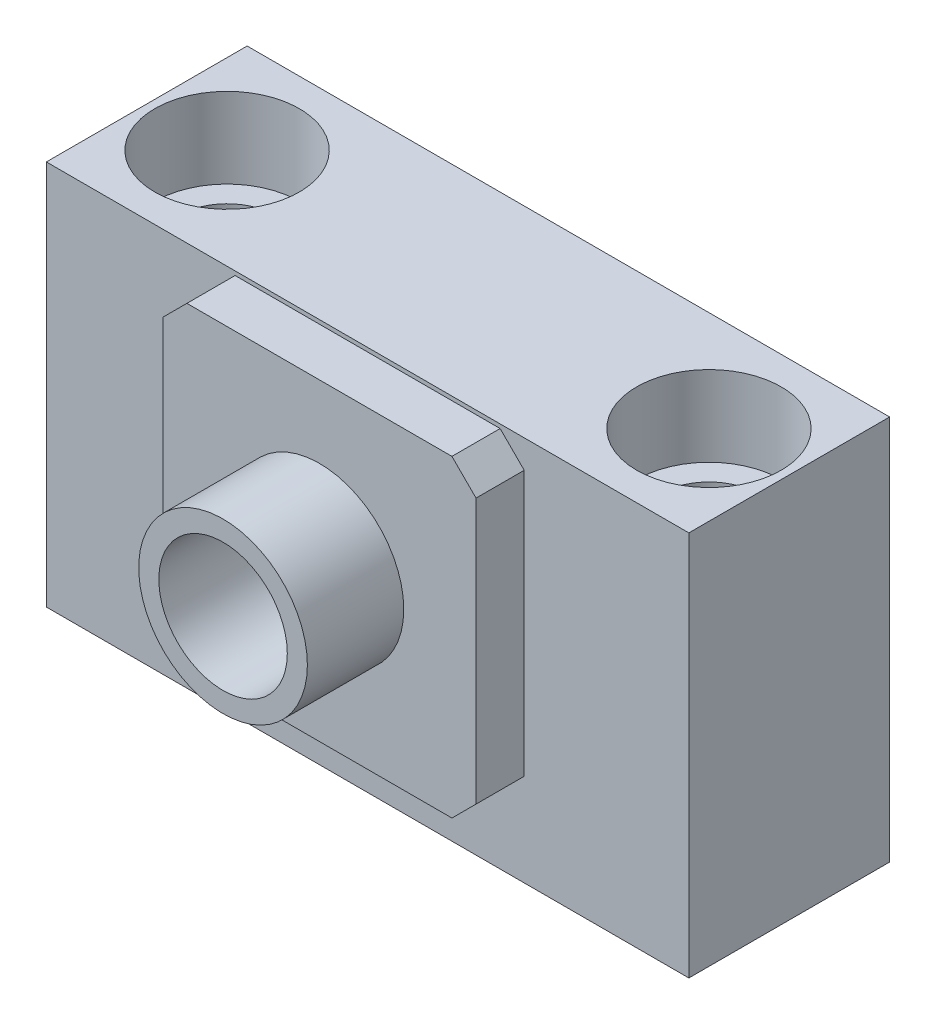
ISO-10303-21;
HEADER;
FILE_DESCRIPTION(('STEP AP214'),'2;1');
FILE_NAME('part.step','',(''),(''),'','','');
FILE_SCHEMA(('AUTOMOTIVE_DESIGN { 1 0 10303 214 1 1 1 1 }'));
ENDSEC;
DATA;
#1=APPLICATION_CONTEXT('core data for automotive mechanical design processes');
#2=APPLICATION_PROTOCOL_DEFINITION('international standard','automotive_design',2000,#1);
#3=PRODUCT_CONTEXT('',#1,'mechanical');
#4=PRODUCT('Part','Part','',(#3));
#5=PRODUCT_RELATED_PRODUCT_CATEGORY('part','',(#4));
#6=PRODUCT_DEFINITION_FORMATION('','',#4);
#7=PRODUCT_DEFINITION_CONTEXT('part definition',#1,'design');
#8=PRODUCT_DEFINITION('design','',#6,#7);
#9=PRODUCT_DEFINITION_SHAPE('','',#8);
#10=(LENGTH_UNIT() NAMED_UNIT(*) SI_UNIT(.MILLI.,.METRE.));
#11=(NAMED_UNIT(*) PLANE_ANGLE_UNIT() SI_UNIT($,.RADIAN.));
#12=(NAMED_UNIT(*) SI_UNIT($,.STERADIAN.) SOLID_ANGLE_UNIT());
#13=UNCERTAINTY_MEASURE_WITH_UNIT(LENGTH_MEASURE(1.E-05),#10,'distance_accuracy_value','');
#14=(GEOMETRIC_REPRESENTATION_CONTEXT(3) GLOBAL_UNCERTAINTY_ASSIGNED_CONTEXT((#13)) GLOBAL_UNIT_ASSIGNED_CONTEXT((#10,
#11,#12)) REPRESENTATION_CONTEXT('',''));
#15=CARTESIAN_POINT('',(0.,0.,0.));
#16=DIRECTION('',(0.,0.,1.));
#17=DIRECTION('',(1.,0.,0.));
#18=AXIS2_PLACEMENT_3D('',#15,#16,#17);
#19=CARTESIAN_POINT('',(40.,28.,43.));
#20=DIRECTION('',(0.,0.,1.));
#21=DIRECTION('',(1.,0.,0.));
#22=AXIS2_PLACEMENT_3D('',#19,#20,#21);
#23=PLANE('',#22);
#24=CARTESIAN_POINT('',(40.,28.,43.));
#25=DIRECTION('',(0.,0.,1.));
#26=DIRECTION('',(1.,0.,0.));
#27=AXIS2_PLACEMENT_3D('',#24,#25,#26);
#28=CIRCLE('',#27,10.5);
#29=CARTESIAN_POINT('',(50.5,28.,43.));
#30=VERTEX_POINT('',#29);
#31=EDGE_CURVE('E11',#30,#30,#28,.T.);
#32=ORIENTED_EDGE('',*,*,#31,.T.);
#33=EDGE_LOOP('',(#32));
#34=FACE_BOUND('',#33,.T.);
#35=CARTESIAN_POINT('',(40.,28.,43.));
#36=DIRECTION('',(0.,0.,1.));
#37=DIRECTION('',(1.,0.,0.));
#38=AXIS2_PLACEMENT_3D('',#35,#36,#37);
#39=CIRCLE('',#38,8.);
#40=CARTESIAN_POINT('',(48.,28.,43.));
#41=VERTEX_POINT('',#40);
#42=EDGE_CURVE('E54',#41,#41,#39,.T.);
#43=ORIENTED_EDGE('',*,*,#42,.F.);
#44=EDGE_LOOP('',(#43));
#45=FACE_BOUND('',#44,.T.);
#46=ADVANCED_FACE('F43',(#34,#45),#23,.T.);
#47=CARTESIAN_POINT('',(40.,28.,31.));
#48=DIRECTION('',(0.,0.,1.));
#49=DIRECTION('',(1.,0.,0.));
#50=AXIS2_PLACEMENT_3D('',#47,#48,#49);
#51=PLANE('',#50);
#52=CARTESIAN_POINT('',(40.,28.,31.));
#53=DIRECTION('',(0.,0.,1.));
#54=DIRECTION('',(1.,0.,0.));
#55=AXIS2_PLACEMENT_3D('',#52,#53,#54);
#56=CIRCLE('',#55,10.5);
#57=CARTESIAN_POINT('',(50.5,28.,31.));
#58=VERTEX_POINT('',#57);
#59=EDGE_CURVE('E47',#58,#58,#56,.T.);
#60=ORIENTED_EDGE('',*,*,#59,.F.);
#61=EDGE_LOOP('',(#60));
#62=FACE_BOUND('',#61,.T.);
#63=CARTESIAN_POINT('',(40.,28.,31.));
#64=DIRECTION('',(0.,0.,1.));
#65=DIRECTION('',(1.,0.,0.));
#66=AXIS2_PLACEMENT_3D('',#63,#64,#65);
#67=CIRCLE('',#66,8.);
#68=CARTESIAN_POINT('',(48.,28.,31.));
#69=VERTEX_POINT('',#68);
#70=EDGE_CURVE('E56',#69,#69,#67,.T.);
#71=ORIENTED_EDGE('',*,*,#70,.T.);
#72=EDGE_LOOP('',(#71));
#73=FACE_BOUND('',#72,.T.);
#74=ADVANCED_FACE('F66',(#62,#73),#51,.F.);
#75=CARTESIAN_POINT('',(40.,28.,43.));
#76=DIRECTION('',(0.,0.,-1.));
#77=DIRECTION('',(-1.,0.,0.));
#78=AXIS2_PLACEMENT_3D('',#75,#76,#77);
#79=CYLINDRICAL_SURFACE('',#78,10.5);
#80=ORIENTED_EDGE('',*,*,#31,.F.);
#81=EDGE_LOOP('',(#80));
#82=FACE_BOUND('',#81,.T.);
#83=ORIENTED_EDGE('',*,*,#59,.T.);
#84=EDGE_LOOP('',(#83));
#85=FACE_BOUND('',#84,.T.);
#86=ADVANCED_FACE('F45',(#82,#85),#79,.T.);
#87=CARTESIAN_POINT('',(40.,28.,43.));
#88=DIRECTION('',(0.,0.,-1.));
#89=DIRECTION('',(-1.,0.,0.));
#90=AXIS2_PLACEMENT_3D('',#87,#88,#89);
#91=CYLINDRICAL_SURFACE('',#90,8.);
#92=ORIENTED_EDGE('',*,*,#42,.T.);
#93=EDGE_LOOP('',(#92));
#94=FACE_BOUND('',#93,.T.);
#95=ORIENTED_EDGE('',*,*,#70,.F.);
#96=EDGE_LOOP('',(#95));
#97=FACE_BOUND('',#96,.T.);
#98=ADVANCED_FACE('F62',(#94,#97),#91,.F.);
#99=CLOSED_SHELL('',(#46,#74,#86,#98));
#100=MANIFOLD_SOLID_BREP('B2',#99);
#101=CARTESIAN_POINT('',(40.,28.,31.));
#102=DIRECTION('',(0.,0.,-1.));
#103=DIRECTION('',(-1.,0.,0.));
#104=AXIS2_PLACEMENT_3D('',#101,#102,#103);
#105=CYLINDRICAL_SURFACE('',#104,7.5);
#106=CARTESIAN_POINT('',(40.,28.,31.));
#107=DIRECTION('',(0.,0.,-1.));
#108=DIRECTION('',(-1.,0.,0.));
#109=AXIS2_PLACEMENT_3D('',#106,#107,#108);
#110=CIRCLE('',#109,7.5);
#111=CARTESIAN_POINT('',(32.5,28.,31.));
#112=VERTEX_POINT('',#111);
#113=EDGE_CURVE('E289',#112,#112,#110,.T.);
#114=ORIENTED_EDGE('',*,*,#113,.F.);
#115=EDGE_LOOP('',(#114));
#116=FACE_BOUND('',#115,.T.);
#117=CARTESIAN_POINT('',(40.,28.,5.));
#118=DIRECTION('',(0.,0.,-1.));
#119=DIRECTION('',(-1.,0.,0.));
#120=AXIS2_PLACEMENT_3D('',#117,#118,#119);
#121=CIRCLE('',#120,7.5);
#122=CARTESIAN_POINT('',(32.5,28.,5.));
#123=VERTEX_POINT('',#122);
#124=EDGE_CURVE('E109',#123,#123,#121,.F.);
#125=ORIENTED_EDGE('',*,*,#124,.F.);
#126=EDGE_LOOP('',(#125));
#127=FACE_BOUND('',#126,.T.);
#128=ADVANCED_FACE('F105',(#116,#127),#105,.F.);
#129=CARTESIAN_POINT('',(0.,48.,25.));
#130=DIRECTION('',(0.,0.,-1.));
#131=DIRECTION('',(-1.,0.,0.));
#132=AXIS2_PLACEMENT_3D('',#129,#130,#131);
#133=PLANE('',#132);
#134=DIRECTION('',(0.,-1.,0.));
#135=VECTOR('',#134,1.);
#136=CARTESIAN_POINT('',(0.,0.,25.));
#137=LINE('',#136,#135);
#138=CARTESIAN_POINT('',(0.,48.,25.));
#139=VERTEX_POINT('',#138);
#140=CARTESIAN_POINT('',(0.,0.,25.));
#141=VERTEX_POINT('',#140);
#142=EDGE_CURVE('E205',#139,#141,#137,.T.);
#143=ORIENTED_EDGE('',*,*,#142,.T.);
#144=DIRECTION('',(1.,0.,0.));
#145=VECTOR('',#144,1.);
#146=CARTESIAN_POINT('',(0.,0.,25.));
#147=LINE('',#146,#145);
#148=CARTESIAN_POINT('',(80.,0.,25.));
#149=VERTEX_POINT('',#148);
#150=EDGE_CURVE('E194',#141,#149,#147,.T.);
#151=ORIENTED_EDGE('',*,*,#150,.T.);
#152=DIRECTION('',(0.,1.,0.));
#153=VECTOR('',#152,1.);
#154=CARTESIAN_POINT('',(80.,0.,25.));
#155=LINE('',#154,#153);
#156=CARTESIAN_POINT('',(80.,48.,25.));
#157=VERTEX_POINT('',#156);
#158=EDGE_CURVE('E204',#149,#157,#155,.T.);
#159=ORIENTED_EDGE('',*,*,#158,.T.);
#160=DIRECTION('',(-1.,0.,0.));
#161=VECTOR('',#160,1.);
#162=CARTESIAN_POINT('',(0.,48.,25.));
#163=LINE('',#162,#161);
#164=EDGE_CURVE('E210',#157,#139,#163,.T.);
#165=ORIENTED_EDGE('',*,*,#164,.T.);
#166=EDGE_LOOP('',(#143,#151,#159,#165));
#167=FACE_BOUND('',#166,.T.);
#168=DIRECTION('',(0.,-1.,0.));
#169=VECTOR('',#168,1.);
#170=CARTESIAN_POINT('',(20.5,47.5,25.));
#171=LINE('',#170,#169);
#172=CARTESIAN_POINT('',(20.5,44.5,25.));
#173=VERTEX_POINT('',#172);
#174=CARTESIAN_POINT('',(20.5,11.5,25.));
#175=VERTEX_POINT('',#174);
#176=EDGE_CURVE('E286',#173,#175,#171,.T.);
#177=ORIENTED_EDGE('',*,*,#176,.F.);
#178=DIRECTION('',(-0.707106781186548,-0.707106781186548,0.));
#179=VECTOR('',#178,1.);
#180=CARTESIAN_POINT('',(12.,36.,25.));
#181=LINE('',#180,#179);
#182=CARTESIAN_POINT('',(23.5,47.5,25.));
#183=VERTEX_POINT('',#182);
#184=EDGE_CURVE('E41',#173,#183,#181,.F.);
#185=ORIENTED_EDGE('',*,*,#184,.T.);
#186=DIRECTION('',(-1.,0.,0.));
#187=VECTOR('',#186,1.);
#188=CARTESIAN_POINT('',(20.5,47.5,25.));
#189=LINE('',#188,#187);
#190=CARTESIAN_POINT('',(56.5,47.5,25.));
#191=VERTEX_POINT('',#190);
#192=EDGE_CURVE('E258',#191,#183,#189,.T.);
#193=ORIENTED_EDGE('',*,*,#192,.F.);
#194=DIRECTION('',(-0.707106781186548,0.707106781186548,0.));
#195=VECTOR('',#194,1.);
#196=CARTESIAN_POINT('',(28.,76.,25.));
#197=LINE('',#196,#195);
#198=CARTESIAN_POINT('',(59.5,44.5,25.));
#199=VERTEX_POINT('',#198);
#200=EDGE_CURVE('E114',#191,#199,#197,.F.);
#201=ORIENTED_EDGE('',*,*,#200,.T.);
#202=DIRECTION('',(0.,1.,0.));
#203=VECTOR('',#202,1.);
#204=CARTESIAN_POINT('',(59.5,47.5,25.));
#205=LINE('',#204,#203);
#206=CARTESIAN_POINT('',(59.5,11.5,25.));
#207=VERTEX_POINT('',#206);
#208=EDGE_CURVE('E257',#207,#199,#205,.T.);
#209=ORIENTED_EDGE('',*,*,#208,.F.);
#210=DIRECTION('',(0.707106781186549,0.707106781186546,0.));
#211=VECTOR('',#210,1.);
#212=CARTESIAN_POINT('',(47.9999999999999,0.,25.));
#213=LINE('',#212,#211);
#214=CARTESIAN_POINT('',(56.5,8.50000000000001,25.));
#215=VERTEX_POINT('',#214);
#216=EDGE_CURVE('E253',#207,#215,#213,.F.);
#217=ORIENTED_EDGE('',*,*,#216,.T.);
#218=DIRECTION('',(1.,0.,0.));
#219=VECTOR('',#218,1.);
#220=CARTESIAN_POINT('',(20.5,8.50000000000001,25.));
#221=LINE('',#220,#219);
#222=CARTESIAN_POINT('',(23.5,8.50000000000001,25.));
#223=VERTEX_POINT('',#222);
#224=EDGE_CURVE('E264',#223,#215,#221,.T.);
#225=ORIENTED_EDGE('',*,*,#224,.F.);
#226=DIRECTION('',(0.707106781186546,-0.707106781186549,0.));
#227=VECTOR('',#226,1.);
#228=CARTESIAN_POINT('',(-7.99999999999993,40.0000000000001,25.));
#229=LINE('',#228,#227);
#230=EDGE_CURVE('E251',#223,#175,#229,.F.);
#231=ORIENTED_EDGE('',*,*,#230,.T.);
#232=EDGE_LOOP('',(#177,#185,#193,#201,#209,#217,#225,#231));
#233=FACE_BOUND('',#232,.T.);
#234=ADVANCED_FACE('F208',(#167,#233),#133,.F.);
#235=CARTESIAN_POINT('',(0.,0.,25.));
#236=DIRECTION('',(1.,0.,0.));
#237=DIRECTION('',(0.,0.,-1.));
#238=AXIS2_PLACEMENT_3D('',#235,#236,#237);
#239=PLANE('',#238);
#240=DIRECTION('',(0.,-1.,0.));
#241=VECTOR('',#240,1.);
#242=CARTESIAN_POINT('',(0.,0.,0.));
#243=LINE('',#242,#241);
#244=CARTESIAN_POINT('',(0.,48.,0.));
#245=VERTEX_POINT('',#244);
#246=CARTESIAN_POINT('',(0.,0.,0.));
#247=VERTEX_POINT('',#246);
#248=EDGE_CURVE('E218',#245,#247,#243,.T.);
#249=ORIENTED_EDGE('',*,*,#248,.T.);
#250=DIRECTION('',(0.,0.,-1.));
#251=VECTOR('',#250,1.);
#252=CARTESIAN_POINT('',(0.,0.,25.));
#253=LINE('',#252,#251);
#254=EDGE_CURVE('E198',#141,#247,#253,.T.);
#255=ORIENTED_EDGE('',*,*,#254,.F.);
#256=ORIENTED_EDGE('',*,*,#142,.F.);
#257=DIRECTION('',(0.,0.,-1.));
#258=VECTOR('',#257,1.);
#259=CARTESIAN_POINT('',(0.,48.,25.));
#260=LINE('',#259,#258);
#261=EDGE_CURVE('E295',#139,#245,#260,.T.);
#262=ORIENTED_EDGE('',*,*,#261,.T.);
#263=EDGE_LOOP('',(#249,#255,#256,#262));
#264=FACE_BOUND('',#263,.T.);
#265=ADVANCED_FACE('F216',(#264),#239,.F.);
#266=CARTESIAN_POINT('',(0.,0.,25.));
#267=DIRECTION('',(0.,1.,0.));
#268=DIRECTION('',(0.,0.,1.));
#269=AXIS2_PLACEMENT_3D('',#266,#267,#268);
#270=PLANE('',#269);
#271=CARTESIAN_POINT('',(70.,0.,12.5));
#272=DIRECTION('',(0.,1.,0.));
#273=DIRECTION('',(0.,0.,1.));
#274=AXIS2_PLACEMENT_3D('',#271,#272,#273);
#275=CIRCLE('',#274,5.99999999999999);
#276=CARTESIAN_POINT('',(70.,0.,18.5));
#277=VERTEX_POINT('',#276);
#278=EDGE_CURVE('E496',#277,#277,#275,.T.);
#279=ORIENTED_EDGE('',*,*,#278,.T.);
#280=EDGE_LOOP('',(#279));
#281=FACE_BOUND('',#280,.T.);
#282=CARTESIAN_POINT('',(9.99999999999999,0.,12.5));
#283=DIRECTION('',(0.,1.,0.));
#284=DIRECTION('',(0.,0.,1.));
#285=AXIS2_PLACEMENT_3D('',#282,#283,#284);
#286=CIRCLE('',#285,5.99999999999999);
#287=CARTESIAN_POINT('',(9.99999999999999,0.,18.5));
#288=VERTEX_POINT('',#287);
#289=EDGE_CURVE('E359',#288,#288,#286,.T.);
#290=ORIENTED_EDGE('',*,*,#289,.T.);
#291=EDGE_LOOP('',(#290));
#292=FACE_BOUND('',#291,.T.);
#293=DIRECTION('',(1.,0.,0.));
#294=VECTOR('',#293,1.);
#295=CARTESIAN_POINT('',(0.,0.,0.));
#296=LINE('',#295,#294);
#297=CARTESIAN_POINT('',(80.,0.,0.));
#298=VERTEX_POINT('',#297);
#299=EDGE_CURVE('E280',#247,#298,#296,.T.);
#300=ORIENTED_EDGE('',*,*,#299,.T.);
#301=DIRECTION('',(0.,0.,-1.));
#302=VECTOR('',#301,1.);
#303=CARTESIAN_POINT('',(80.,0.,25.));
#304=LINE('',#303,#302);
#305=EDGE_CURVE('E201',#149,#298,#304,.T.);
#306=ORIENTED_EDGE('',*,*,#305,.F.);
#307=ORIENTED_EDGE('',*,*,#150,.F.);
#308=ORIENTED_EDGE('',*,*,#254,.T.);
#309=EDGE_LOOP('',(#300,#306,#307,#308));
#310=FACE_BOUND('',#309,.T.);
#311=ADVANCED_FACE('F196',(#281,#292,#310),#270,.F.);
#312=CARTESIAN_POINT('',(80.,0.,25.));
#313=DIRECTION('',(-1.,0.,0.));
#314=DIRECTION('',(0.,0.,1.));
#315=AXIS2_PLACEMENT_3D('',#312,#313,#314);
#316=PLANE('',#315);
#317=DIRECTION('',(0.,1.,0.));
#318=VECTOR('',#317,1.);
#319=CARTESIAN_POINT('',(80.,0.,0.));
#320=LINE('',#319,#318);
#321=CARTESIAN_POINT('',(80.,48.,0.));
#322=VERTEX_POINT('',#321);
#323=EDGE_CURVE('E298',#298,#322,#320,.T.);
#324=ORIENTED_EDGE('',*,*,#323,.T.);
#325=DIRECTION('',(0.,0.,-1.));
#326=VECTOR('',#325,1.);
#327=CARTESIAN_POINT('',(80.,48.,25.));
#328=LINE('',#327,#326);
#329=EDGE_CURVE('E223',#157,#322,#328,.T.);
#330=ORIENTED_EDGE('',*,*,#329,.F.);
#331=ORIENTED_EDGE('',*,*,#158,.F.);
#332=ORIENTED_EDGE('',*,*,#305,.T.);
#333=EDGE_LOOP('',(#324,#330,#331,#332));
#334=FACE_BOUND('',#333,.T.);
#335=ADVANCED_FACE('F310',(#334),#316,.F.);
#336=CARTESIAN_POINT('',(0.,48.,25.));
#337=DIRECTION('',(0.,-1.,0.));
#338=DIRECTION('',(0.,0.,-1.));
#339=AXIS2_PLACEMENT_3D('',#336,#337,#338);
#340=PLANE('',#339);
#341=CARTESIAN_POINT('',(70.,48.,12.5));
#342=DIRECTION('',(0.,1.,0.));
#343=DIRECTION('',(0.,0.,1.));
#344=AXIS2_PLACEMENT_3D('',#341,#342,#343);
#345=CIRCLE('',#344,9.00000000000001);
#346=CARTESIAN_POINT('',(70.,48.,21.5));
#347=VERTEX_POINT('',#346);
#348=EDGE_CURVE('E489',#347,#347,#345,.T.);
#349=ORIENTED_EDGE('',*,*,#348,.F.);
#350=EDGE_LOOP('',(#349));
#351=FACE_BOUND('',#350,.T.);
#352=CARTESIAN_POINT('',(9.99999999999999,48.,12.5));
#353=DIRECTION('',(0.,1.,0.));
#354=DIRECTION('',(0.,0.,1.));
#355=AXIS2_PLACEMENT_3D('',#352,#353,#354);
#356=CIRCLE('',#355,9.);
#357=CARTESIAN_POINT('',(9.99999999999999,48.,21.5));
#358=VERTEX_POINT('',#357);
#359=EDGE_CURVE('E499',#358,#358,#356,.T.);
#360=ORIENTED_EDGE('',*,*,#359,.F.);
#361=EDGE_LOOP('',(#360));
#362=FACE_BOUND('',#361,.T.);
#363=DIRECTION('',(-1.,0.,0.));
#364=VECTOR('',#363,1.);
#365=CARTESIAN_POINT('',(0.,48.,0.));
#366=LINE('',#365,#364);
#367=EDGE_CURVE('E214',#322,#245,#366,.T.);
#368=ORIENTED_EDGE('',*,*,#367,.T.);
#369=ORIENTED_EDGE('',*,*,#261,.F.);
#370=ORIENTED_EDGE('',*,*,#164,.F.);
#371=ORIENTED_EDGE('',*,*,#329,.T.);
#372=EDGE_LOOP('',(#368,#369,#370,#371));
#373=FACE_BOUND('',#372,.T.);
#374=ADVANCED_FACE('F305',(#351,#362,#373),#340,.F.);
#375=CARTESIAN_POINT('',(0.,48.,0.));
#376=DIRECTION('',(0.,0.,-1.));
#377=DIRECTION('',(-1.,0.,0.));
#378=AXIS2_PLACEMENT_3D('',#375,#376,#377);
#379=PLANE('',#378);
#380=CARTESIAN_POINT('',(40.,28.,0.));
#381=DIRECTION('',(0.,0.,-1.));
#382=DIRECTION('',(-1.,0.,0.));
#383=AXIS2_PLACEMENT_3D('',#380,#381,#382);
#384=CIRCLE('',#383,10.);
#385=CARTESIAN_POINT('',(30.,28.,0.));
#386=VERTEX_POINT('',#385);
#387=EDGE_CURVE('E356',#386,#386,#384,.T.);
#388=ORIENTED_EDGE('',*,*,#387,.F.);
#389=EDGE_LOOP('',(#388));
#390=FACE_BOUND('',#389,.T.);
#391=ORIENTED_EDGE('',*,*,#248,.F.);
#392=ORIENTED_EDGE('',*,*,#367,.F.);
#393=ORIENTED_EDGE('',*,*,#323,.F.);
#394=ORIENTED_EDGE('',*,*,#299,.F.);
#395=EDGE_LOOP('',(#391,#392,#393,#394));
#396=FACE_BOUND('',#395,.T.);
#397=ADVANCED_FACE('F309',(#390,#396),#379,.T.);
#398=CARTESIAN_POINT('',(20.5,47.5,31.));
#399=DIRECTION('',(1.,0.,0.));
#400=DIRECTION('',(0.,1.,0.));
#401=AXIS2_PLACEMENT_3D('',#398,#399,#400);
#402=PLANE('',#401);
#403=ORIENTED_EDGE('',*,*,#176,.T.);
#404=DIRECTION('',(0.,0.,1.));
#405=VECTOR('',#404,1.);
#406=CARTESIAN_POINT('',(20.5,11.5,31.));
#407=LINE('',#406,#405);
#408=CARTESIAN_POINT('',(20.5,11.5,31.));
#409=VERTEX_POINT('',#408);
#410=EDGE_CURVE('E232',#175,#409,#407,.T.);
#411=ORIENTED_EDGE('',*,*,#410,.T.);
#412=DIRECTION('',(0.,-1.,0.));
#413=VECTOR('',#412,1.);
#414=CARTESIAN_POINT('',(20.5,47.5,31.));
#415=LINE('',#414,#413);
#416=CARTESIAN_POINT('',(20.5,44.5,31.));
#417=VERTEX_POINT('',#416);
#418=EDGE_CURVE('E292',#417,#409,#415,.T.);
#419=ORIENTED_EDGE('',*,*,#418,.F.);
#420=DIRECTION('',(0.,0.,-1.));
#421=VECTOR('',#420,1.);
#422=CARTESIAN_POINT('',(20.5,44.5,31.));
#423=LINE('',#422,#421);
#424=EDGE_CURVE('E229',#417,#173,#423,.T.);
#425=ORIENTED_EDGE('',*,*,#424,.T.);
#426=EDGE_LOOP('',(#403,#411,#419,#425));
#427=FACE_BOUND('',#426,.T.);
#428=ADVANCED_FACE('F345',(#427),#402,.F.);
#429=CARTESIAN_POINT('',(20.5,8.50000000000001,31.));
#430=DIRECTION('',(0.,1.,0.));
#431=DIRECTION('',(-1.,0.,0.));
#432=AXIS2_PLACEMENT_3D('',#429,#430,#431);
#433=PLANE('',#432);
#434=DIRECTION('',(1.,0.,0.));
#435=VECTOR('',#434,1.);
#436=CARTESIAN_POINT('',(20.5,8.50000000000001,31.));
#437=LINE('',#436,#435);
#438=CARTESIAN_POINT('',(23.5,8.50000000000001,31.));
#439=VERTEX_POINT('',#438);
#440=CARTESIAN_POINT('',(56.5,8.50000000000001,31.));
#441=VERTEX_POINT('',#440);
#442=EDGE_CURVE('E282',#439,#441,#437,.T.);
#443=ORIENTED_EDGE('',*,*,#442,.F.);
#444=DIRECTION('',(0.,0.,-1.));
#445=VECTOR('',#444,1.);
#446=CARTESIAN_POINT('',(23.5,8.50000000000001,31.));
#447=LINE('',#446,#445);
#448=EDGE_CURVE('E221',#439,#223,#447,.T.);
#449=ORIENTED_EDGE('',*,*,#448,.T.);
#450=ORIENTED_EDGE('',*,*,#224,.T.);
#451=DIRECTION('',(0.,0.,1.));
#452=VECTOR('',#451,1.);
#453=CARTESIAN_POINT('',(56.5,8.50000000000001,31.));
#454=LINE('',#453,#452);
#455=EDGE_CURVE('E219',#215,#441,#454,.T.);
#456=ORIENTED_EDGE('',*,*,#455,.T.);
#457=EDGE_LOOP('',(#443,#449,#450,#456));
#458=FACE_BOUND('',#457,.T.);
#459=ADVANCED_FACE('F342',(#458),#433,.F.);
#460=CARTESIAN_POINT('',(59.5,47.5,31.));
#461=DIRECTION('',(-1.,0.,0.));
#462=DIRECTION('',(0.,-1.,0.));
#463=AXIS2_PLACEMENT_3D('',#460,#461,#462);
#464=PLANE('',#463);
#465=DIRECTION('',(0.,1.,0.));
#466=VECTOR('',#465,1.);
#467=CARTESIAN_POINT('',(59.5,47.5,31.));
#468=LINE('',#467,#466);
#469=CARTESIAN_POINT('',(59.5,11.5,31.));
#470=VERTEX_POINT('',#469);
#471=CARTESIAN_POINT('',(59.5,44.5,31.));
#472=VERTEX_POINT('',#471);
#473=EDGE_CURVE('E275',#470,#472,#468,.T.);
#474=ORIENTED_EDGE('',*,*,#473,.F.);
#475=DIRECTION('',(0.,0.,-1.));
#476=VECTOR('',#475,1.);
#477=CARTESIAN_POINT('',(59.5,11.5,31.));
#478=LINE('',#477,#476);
#479=EDGE_CURVE('E244',#470,#207,#478,.T.);
#480=ORIENTED_EDGE('',*,*,#479,.T.);
#481=ORIENTED_EDGE('',*,*,#208,.T.);
#482=DIRECTION('',(0.,0.,1.));
#483=VECTOR('',#482,1.);
#484=CARTESIAN_POINT('',(59.5,44.5,31.));
#485=LINE('',#484,#483);
#486=EDGE_CURVE('E242',#199,#472,#485,.T.);
#487=ORIENTED_EDGE('',*,*,#486,.T.);
#488=EDGE_LOOP('',(#474,#480,#481,#487));
#489=FACE_BOUND('',#488,.T.);
#490=ADVANCED_FACE('F261',(#489),#464,.F.);
#491=CARTESIAN_POINT('',(20.5,47.5,31.));
#492=DIRECTION('',(0.,-1.,0.));
#493=DIRECTION('',(1.,0.,0.));
#494=AXIS2_PLACEMENT_3D('',#491,#492,#493);
#495=PLANE('',#494);
#496=DIRECTION('',(-1.,0.,0.));
#497=VECTOR('',#496,1.);
#498=CARTESIAN_POINT('',(20.5,47.5,31.));
#499=LINE('',#498,#497);
#500=CARTESIAN_POINT('',(56.5,47.5,31.));
#501=VERTEX_POINT('',#500);
#502=CARTESIAN_POINT('',(23.5,47.5,31.));
#503=VERTEX_POINT('',#502);
#504=EDGE_CURVE('E273',#501,#503,#499,.T.);
#505=ORIENTED_EDGE('',*,*,#504,.F.);
#506=DIRECTION('',(0.,0.,-1.));
#507=VECTOR('',#506,1.);
#508=CARTESIAN_POINT('',(56.5,47.5,31.));
#509=LINE('',#508,#507);
#510=EDGE_CURVE('E249',#501,#191,#509,.T.);
#511=ORIENTED_EDGE('',*,*,#510,.T.);
#512=ORIENTED_EDGE('',*,*,#192,.T.);
#513=DIRECTION('',(0.,0.,1.));
#514=VECTOR('',#513,1.);
#515=CARTESIAN_POINT('',(23.5,47.5,31.));
#516=LINE('',#515,#514);
#517=EDGE_CURVE('E247',#183,#503,#516,.T.);
#518=ORIENTED_EDGE('',*,*,#517,.T.);
#519=EDGE_LOOP('',(#505,#511,#512,#518));
#520=FACE_BOUND('',#519,.T.);
#521=ADVANCED_FACE('F277',(#520),#495,.F.);
#522=CARTESIAN_POINT('',(20.5,8.50000000000001,31.));
#523=DIRECTION('',(0.,0.,1.));
#524=DIRECTION('',(1.,0.,0.));
#525=AXIS2_PLACEMENT_3D('',#522,#523,#524);
#526=PLANE('',#525);
#527=ORIENTED_EDGE('',*,*,#113,.T.);
#528=EDGE_LOOP('',(#527));
#529=FACE_BOUND('',#528,.T.);
#530=ORIENTED_EDGE('',*,*,#418,.T.);
#531=DIRECTION('',(-0.707106781186546,0.707106781186549,0.));
#532=VECTOR('',#531,1.);
#533=CARTESIAN_POINT('',(22.,10.,31.));
#534=LINE('',#533,#532);
#535=EDGE_CURVE('E240',#409,#439,#534,.F.);
#536=ORIENTED_EDGE('',*,*,#535,.T.);
#537=ORIENTED_EDGE('',*,*,#442,.T.);
#538=DIRECTION('',(-0.707106781186549,-0.707106781186546,0.));
#539=VECTOR('',#538,1.);
#540=CARTESIAN_POINT('',(38.4999999999999,-9.49999999999999,31.));
#541=LINE('',#540,#539);
#542=EDGE_CURVE('E238',#441,#470,#541,.F.);
#543=ORIENTED_EDGE('',*,*,#542,.T.);
#544=ORIENTED_EDGE('',*,*,#473,.T.);
#545=DIRECTION('',(0.707106781186548,-0.707106781186548,0.));
#546=VECTOR('',#545,1.);
#547=CARTESIAN_POINT('',(58.,46.,31.));
#548=LINE('',#547,#546);
#549=EDGE_CURVE('E236',#472,#501,#548,.F.);
#550=ORIENTED_EDGE('',*,*,#549,.T.);
#551=ORIENTED_EDGE('',*,*,#504,.T.);
#552=DIRECTION('',(0.707106781186548,0.707106781186548,0.));
#553=VECTOR('',#552,1.);
#554=CARTESIAN_POINT('',(2.49999999999999,26.5,31.));
#555=LINE('',#554,#553);
#556=EDGE_CURVE('E234',#503,#417,#555,.F.);
#557=ORIENTED_EDGE('',*,*,#556,.T.);
#558=EDGE_LOOP('',(#530,#536,#537,#543,#544,#550,#551,#557));
#559=FACE_BOUND('',#558,.T.);
#560=ADVANCED_FACE('F272',(#529,#559),#526,.T.);
#561=CARTESIAN_POINT('',(23.5,8.50000000000001,31.));
#562=DIRECTION('',(0.707106781186549,0.707106781186546,0.));
#563=DIRECTION('',(-0.707106781186546,0.707106781186549,0.));
#564=AXIS2_PLACEMENT_3D('',#561,#562,#563);
#565=PLANE('',#564);
#566=ORIENTED_EDGE('',*,*,#535,.F.);
#567=ORIENTED_EDGE('',*,*,#410,.F.);
#568=ORIENTED_EDGE('',*,*,#230,.F.);
#569=ORIENTED_EDGE('',*,*,#448,.F.);
#570=EDGE_LOOP('',(#566,#567,#568,#569));
#571=FACE_BOUND('',#570,.T.);
#572=ADVANCED_FACE('F336',(#571),#565,.F.);
#573=CARTESIAN_POINT('',(59.5,11.5,31.));
#574=DIRECTION('',(-0.707106781186546,0.707106781186549,0.));
#575=DIRECTION('',(-0.707106781186549,-0.707106781186546,0.));
#576=AXIS2_PLACEMENT_3D('',#573,#574,#575);
#577=PLANE('',#576);
#578=ORIENTED_EDGE('',*,*,#542,.F.);
#579=ORIENTED_EDGE('',*,*,#455,.F.);
#580=ORIENTED_EDGE('',*,*,#216,.F.);
#581=ORIENTED_EDGE('',*,*,#479,.F.);
#582=EDGE_LOOP('',(#578,#579,#580,#581));
#583=FACE_BOUND('',#582,.T.);
#584=ADVANCED_FACE('F376',(#583),#577,.F.);
#585=CARTESIAN_POINT('',(56.5,47.5,31.));
#586=DIRECTION('',(-0.707106781186548,-0.707106781186548,0.));
#587=DIRECTION('',(0.707106781186548,-0.707106781186548,0.));
#588=AXIS2_PLACEMENT_3D('',#585,#586,#587);
#589=PLANE('',#588);
#590=ORIENTED_EDGE('',*,*,#549,.F.);
#591=ORIENTED_EDGE('',*,*,#486,.F.);
#592=ORIENTED_EDGE('',*,*,#200,.F.);
#593=ORIENTED_EDGE('',*,*,#510,.F.);
#594=EDGE_LOOP('',(#590,#591,#592,#593));
#595=FACE_BOUND('',#594,.T.);
#596=ADVANCED_FACE('F267',(#595),#589,.F.);
#597=CARTESIAN_POINT('',(20.5,44.5,31.));
#598=DIRECTION('',(0.707106781186548,-0.707106781186548,0.));
#599=DIRECTION('',(0.707106781186548,0.707106781186548,0.));
#600=AXIS2_PLACEMENT_3D('',#597,#598,#599);
#601=PLANE('',#600);
#602=ORIENTED_EDGE('',*,*,#556,.F.);
#603=ORIENTED_EDGE('',*,*,#517,.F.);
#604=ORIENTED_EDGE('',*,*,#184,.F.);
#605=ORIENTED_EDGE('',*,*,#424,.F.);
#606=EDGE_LOOP('',(#602,#603,#604,#605));
#607=FACE_BOUND('',#606,.T.);
#608=ADVANCED_FACE('F107',(#607),#601,.F.);
#609=CARTESIAN_POINT('',(40.,28.,5.));
#610=DIRECTION('',(0.,0.,-1.));
#611=DIRECTION('',(-1.,0.,0.));
#612=AXIS2_PLACEMENT_3D('',#609,#610,#611);
#613=PLANE('',#612);
#614=CARTESIAN_POINT('',(40.,28.,5.));
#615=DIRECTION('',(0.,0.,-1.));
#616=DIRECTION('',(-1.,0.,0.));
#617=AXIS2_PLACEMENT_3D('',#614,#615,#616);
#618=CIRCLE('',#617,10.);
#619=CARTESIAN_POINT('',(30.,28.,5.));
#620=VERTEX_POINT('',#619);
#621=EDGE_CURVE('E358',#620,#620,#618,.T.);
#622=ORIENTED_EDGE('',*,*,#621,.T.);
#623=EDGE_LOOP('',(#622));
#624=FACE_BOUND('',#623,.T.);
#625=ORIENTED_EDGE('',*,*,#124,.T.);
#626=EDGE_LOOP('',(#625));
#627=FACE_BOUND('',#626,.T.);
#628=ADVANCED_FACE('F384',(#624,#627),#613,.T.);
#629=CARTESIAN_POINT('',(40.,28.,5.));
#630=DIRECTION('',(0.,0.,-1.));
#631=DIRECTION('',(-1.,0.,0.));
#632=AXIS2_PLACEMENT_3D('',#629,#630,#631);
#633=CYLINDRICAL_SURFACE('',#632,10.);
#634=ORIENTED_EDGE('',*,*,#621,.F.);
#635=EDGE_LOOP('',(#634));
#636=FACE_BOUND('',#635,.T.);
#637=ORIENTED_EDGE('',*,*,#387,.T.);
#638=EDGE_LOOP('',(#637));
#639=FACE_BOUND('',#638,.T.);
#640=ADVANCED_FACE('F332',(#636,#639),#633,.F.);
#641=CARTESIAN_POINT('',(9.99999999999999,48.,12.5));
#642=DIRECTION('',(0.,1.,0.));
#643=DIRECTION('',(0.,0.,1.));
#644=AXIS2_PLACEMENT_3D('',#641,#642,#643);
#645=CYLINDRICAL_SURFACE('',#644,5.99999999999999);
#646=ORIENTED_EDGE('',*,*,#289,.F.);
#647=EDGE_LOOP('',(#646));
#648=FACE_BOUND('',#647,.T.);
#649=CARTESIAN_POINT('',(9.99999999999999,38.,12.5));
#650=DIRECTION('',(0.,1.,0.));
#651=DIRECTION('',(0.,0.,1.));
#652=AXIS2_PLACEMENT_3D('',#649,#650,#651);
#653=CIRCLE('',#652,6.);
#654=CARTESIAN_POINT('',(9.99999999999999,38.,18.5));
#655=VERTEX_POINT('',#654);
#656=EDGE_CURVE('E364',#655,#655,#653,.T.);
#657=ORIENTED_EDGE('',*,*,#656,.T.);
#658=EDGE_LOOP('',(#657));
#659=FACE_BOUND('',#658,.T.);
#660=ADVANCED_FACE('F424',(#648,#659),#645,.F.);
#661=CARTESIAN_POINT('',(16.,38.,12.5));
#662=DIRECTION('',(0.,-1.,0.));
#663=DIRECTION('',(0.,0.,-1.));
#664=AXIS2_PLACEMENT_3D('',#661,#662,#663);
#665=PLANE('',#664);
#666=ORIENTED_EDGE('',*,*,#656,.F.);
#667=EDGE_LOOP('',(#666));
#668=FACE_BOUND('',#667,.T.);
#669=CARTESIAN_POINT('',(9.99999999999999,38.,12.5));
#670=DIRECTION('',(0.,1.,0.));
#671=DIRECTION('',(0.,0.,1.));
#672=AXIS2_PLACEMENT_3D('',#669,#670,#671);
#673=CIRCLE('',#672,9.);
#674=CARTESIAN_POINT('',(9.99999999999999,38.,21.5));
#675=VERTEX_POINT('',#674);
#676=EDGE_CURVE('E502',#675,#675,#673,.T.);
#677=ORIENTED_EDGE('',*,*,#676,.T.);
#678=EDGE_LOOP('',(#677));
#679=FACE_BOUND('',#678,.T.);
#680=ADVANCED_FACE('F429',(#668,#679),#665,.F.);
#681=CARTESIAN_POINT('',(9.99999999999999,48.,12.5));
#682=DIRECTION('',(0.,1.,0.));
#683=DIRECTION('',(0.,0.,1.));
#684=AXIS2_PLACEMENT_3D('',#681,#682,#683);
#685=CYLINDRICAL_SURFACE('',#684,9.);
#686=ORIENTED_EDGE('',*,*,#676,.F.);
#687=EDGE_LOOP('',(#686));
#688=FACE_BOUND('',#687,.T.);
#689=ORIENTED_EDGE('',*,*,#359,.T.);
#690=EDGE_LOOP('',(#689));
#691=FACE_BOUND('',#690,.T.);
#692=ADVANCED_FACE('F439',(#688,#691),#685,.F.);
#693=CARTESIAN_POINT('',(70.,48.,12.5));
#694=DIRECTION('',(0.,1.,0.));
#695=DIRECTION('',(0.,0.,1.));
#696=AXIS2_PLACEMENT_3D('',#693,#694,#695);
#697=CYLINDRICAL_SURFACE('',#696,6.);
#698=ORIENTED_EDGE('',*,*,#278,.F.);
#699=EDGE_LOOP('',(#698));
#700=FACE_BOUND('',#699,.T.);
#701=CARTESIAN_POINT('',(70.,38.,12.5));
#702=DIRECTION('',(0.,1.,0.));
#703=DIRECTION('',(0.,0.,1.));
#704=AXIS2_PLACEMENT_3D('',#701,#702,#703);
#705=CIRCLE('',#704,6.00000000000001);
#706=CARTESIAN_POINT('',(70.,38.,18.5));
#707=VERTEX_POINT('',#706);
#708=EDGE_CURVE('E491',#707,#707,#705,.T.);
#709=ORIENTED_EDGE('',*,*,#708,.T.);
#710=EDGE_LOOP('',(#709));
#711=FACE_BOUND('',#710,.T.);
#712=ADVANCED_FACE('F449',(#700,#711),#697,.F.);
#713=CARTESIAN_POINT('',(76.,38.,12.5));
#714=DIRECTION('',(0.,-1.,0.));
#715=DIRECTION('',(0.,0.,-1.));
#716=AXIS2_PLACEMENT_3D('',#713,#714,#715);
#717=PLANE('',#716);
#718=ORIENTED_EDGE('',*,*,#708,.F.);
#719=EDGE_LOOP('',(#718));
#720=FACE_BOUND('',#719,.T.);
#721=CARTESIAN_POINT('',(70.,38.,12.5));
#722=DIRECTION('',(0.,1.,0.));
#723=DIRECTION('',(0.,0.,1.));
#724=AXIS2_PLACEMENT_3D('',#721,#722,#723);
#725=CIRCLE('',#724,9.00000000000001);
#726=CARTESIAN_POINT('',(70.,38.,21.5));
#727=VERTEX_POINT('',#726);
#728=EDGE_CURVE('E486',#727,#727,#725,.T.);
#729=ORIENTED_EDGE('',*,*,#728,.T.);
#730=EDGE_LOOP('',(#729));
#731=FACE_BOUND('',#730,.T.);
#732=ADVANCED_FACE('F459',(#720,#731),#717,.F.);
#733=CARTESIAN_POINT('',(70.,48.,12.5));
#734=DIRECTION('',(0.,1.,0.));
#735=DIRECTION('',(0.,0.,1.));
#736=AXIS2_PLACEMENT_3D('',#733,#734,#735);
#737=CYLINDRICAL_SURFACE('',#736,9.00000000000001);
#738=ORIENTED_EDGE('',*,*,#728,.F.);
#739=EDGE_LOOP('',(#738));
#740=FACE_BOUND('',#739,.T.);
#741=ORIENTED_EDGE('',*,*,#348,.T.);
#742=EDGE_LOOP('',(#741));
#743=FACE_BOUND('',#742,.T.);
#744=ADVANCED_FACE('F469',(#740,#743),#737,.F.);
#745=CLOSED_SHELL('',(#128,#234,#265,#311,#335,#374,#397,#428,#459,#490,#521,#560,#572,#584,
#596,#608,#628,#640,#660,#680,#692,#712,#732,#744));
#746=MANIFOLD_SOLID_BREP('B6',#745);
#747=ADVANCED_BREP_SHAPE_REPRESENTATION('',(#18,#100,#746),#14);
#748=SHAPE_DEFINITION_REPRESENTATION(#9,#747);
ENDSEC;
END-ISO-10303-21;
